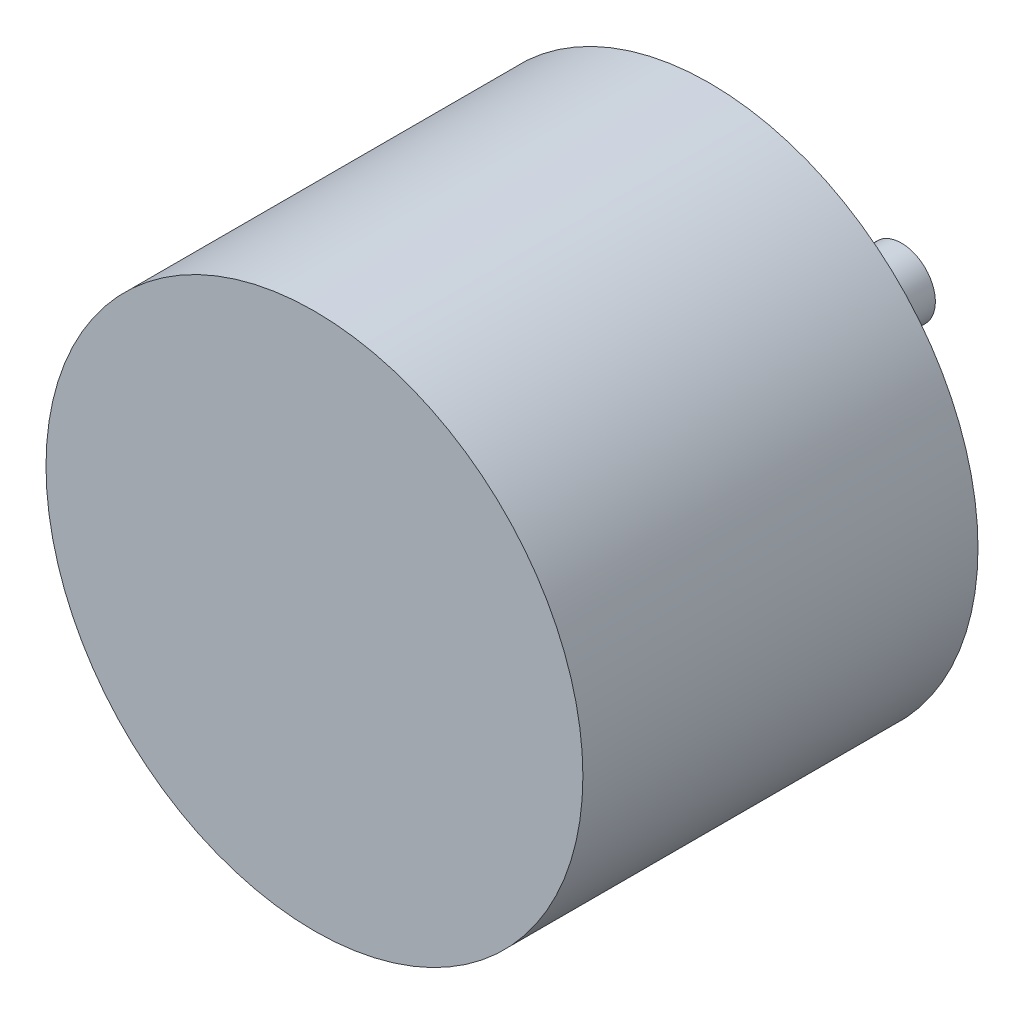
ISO-10303-21;
HEADER;
FILE_DESCRIPTION(('STEP AP214'),'2;1');
FILE_NAME('part.step','',(''),(''),'','','');
FILE_SCHEMA(('AUTOMOTIVE_DESIGN { 1 0 10303 214 1 1 1 1 }'));
ENDSEC;
DATA;
#1=APPLICATION_CONTEXT('core data for automotive mechanical design processes');
#2=APPLICATION_PROTOCOL_DEFINITION('international standard','automotive_design',2000,#1);
#3=PRODUCT_CONTEXT('',#1,'mechanical');
#4=PRODUCT('Part','Part','',(#3));
#5=PRODUCT_RELATED_PRODUCT_CATEGORY('part','',(#4));
#6=PRODUCT_DEFINITION_FORMATION('','',#4);
#7=PRODUCT_DEFINITION_CONTEXT('part definition',#1,'design');
#8=PRODUCT_DEFINITION('design','',#6,#7);
#9=PRODUCT_DEFINITION_SHAPE('','',#8);
#10=(LENGTH_UNIT() NAMED_UNIT(*) SI_UNIT(.MILLI.,.METRE.));
#11=(NAMED_UNIT(*) PLANE_ANGLE_UNIT() SI_UNIT($,.RADIAN.));
#12=(NAMED_UNIT(*) SI_UNIT($,.STERADIAN.) SOLID_ANGLE_UNIT());
#13=UNCERTAINTY_MEASURE_WITH_UNIT(LENGTH_MEASURE(1.E-05),#10,'distance_accuracy_value','');
#14=(GEOMETRIC_REPRESENTATION_CONTEXT(3) GLOBAL_UNCERTAINTY_ASSIGNED_CONTEXT((#13)) GLOBAL_UNIT_ASSIGNED_CONTEXT((#10,
#11,#12)) REPRESENTATION_CONTEXT('',''));
#15=CARTESIAN_POINT('',(0.,0.,0.));
#16=DIRECTION('',(0.,0.,1.));
#17=DIRECTION('',(1.,0.,0.));
#18=AXIS2_PLACEMENT_3D('',#15,#16,#17);
#19=CARTESIAN_POINT('',(-36.9030064596795,0.,9.63283695388817));
#20=DIRECTION('',(0.,0.,-1.));
#21=DIRECTION('',(-1.,0.,0.));
#22=AXIS2_PLACEMENT_3D('',#19,#20,#21);
#23=PLANE('',#22);
#24=CARTESIAN_POINT('',(-36.9030064596795,0.,9.63283695388817));
#25=DIRECTION('',(0.,0.,-1.));
#26=DIRECTION('',(-1.,0.,0.));
#27=AXIS2_PLACEMENT_3D('',#24,#25,#26);
#28=CIRCLE('',#27,23.78);
#29=CARTESIAN_POINT('',(-60.6830064596796,0.,9.63283695388817));
#30=VERTEX_POINT('',#29);
#31=EDGE_CURVE('E10',#30,#30,#28,.T.);
#32=ORIENTED_EDGE('',*,*,#31,.F.);
#33=EDGE_LOOP('',(#32));
#34=FACE_BOUND('',#33,.T.);
#35=ADVANCED_FACE('F32',(#34),#23,.F.);
#36=CARTESIAN_POINT('',(-36.9030064596796,0.,-63.1163378754488));
#37=DIRECTION('',(0.,0.,-1.));
#38=DIRECTION('',(-1.,0.,0.));
#39=AXIS2_PLACEMENT_3D('',#36,#37,#38);
#40=CYLINDRICAL_SURFACE('',#39,23.78);
#41=CARTESIAN_POINT('',(-36.9030064596795,0.,-25.3671630461118));
#42=DIRECTION('',(0.,0.,-1.));
#43=DIRECTION('',(-1.,0.,0.));
#44=AXIS2_PLACEMENT_3D('',#41,#42,#43);
#45=CIRCLE('',#44,23.78);
#46=CARTESIAN_POINT('',(-60.6830064596796,0.,-25.3671630461118));
#47=VERTEX_POINT('',#46);
#48=EDGE_CURVE('E38',#47,#47,#45,.T.);
#49=ORIENTED_EDGE('',*,*,#48,.F.);
#50=EDGE_LOOP('',(#49));
#51=FACE_BOUND('',#50,.T.);
#52=ORIENTED_EDGE('',*,*,#31,.T.);
#53=EDGE_LOOP('',(#52));
#54=FACE_BOUND('',#53,.T.);
#55=ADVANCED_FACE('F95',(#51,#54),#40,.T.);
#56=CARTESIAN_POINT('',(-13.1230064596795,0.,-25.3671630461118));
#57=DIRECTION('',(0.,0.,1.));
#58=DIRECTION('',(1.,0.,0.));
#59=AXIS2_PLACEMENT_3D('',#56,#57,#58);
#60=PLANE('',#59);
#61=CARTESIAN_POINT('',(-25.4030064596795,-11.5,-25.3671630461118));
#62=DIRECTION('',(0.,0.,-1.));
#63=DIRECTION('',(-1.,0.,0.));
#64=AXIS2_PLACEMENT_3D('',#61,#62,#63);
#65=CIRCLE('',#64,2.);
#66=CARTESIAN_POINT('',(-27.4030064596795,-11.5,-25.3671630461118));
#67=VERTEX_POINT('',#66);
#68=EDGE_CURVE('E76',#67,#67,#65,.T.);
#69=ORIENTED_EDGE('',*,*,#68,.F.);
#70=EDGE_LOOP('',(#69));
#71=FACE_BOUND('',#70,.T.);
#72=CARTESIAN_POINT('',(-48.4030064596796,-11.5,-25.3671630461118));
#73=DIRECTION('',(0.,0.,-1.));
#74=DIRECTION('',(-1.,0.,0.));
#75=AXIS2_PLACEMENT_3D('',#72,#73,#74);
#76=CIRCLE('',#75,2.);
#77=CARTESIAN_POINT('',(-50.4030064596796,-11.5,-25.3671630461118));
#78=VERTEX_POINT('',#77);
#79=EDGE_CURVE('E70',#78,#78,#76,.T.);
#80=ORIENTED_EDGE('',*,*,#79,.F.);
#81=EDGE_LOOP('',(#80));
#82=FACE_BOUND('',#81,.T.);
#83=CARTESIAN_POINT('',(-48.4030064596796,11.5,-25.3671630461118));
#84=DIRECTION('',(0.,0.,-1.));
#85=DIRECTION('',(-1.,0.,0.));
#86=AXIS2_PLACEMENT_3D('',#83,#84,#85);
#87=CIRCLE('',#86,2.);
#88=CARTESIAN_POINT('',(-50.4030064596796,11.5,-25.3671630461118));
#89=VERTEX_POINT('',#88);
#90=EDGE_CURVE('E64',#89,#89,#87,.T.);
#91=ORIENTED_EDGE('',*,*,#90,.F.);
#92=EDGE_LOOP('',(#91));
#93=FACE_BOUND('',#92,.T.);
#94=CARTESIAN_POINT('',(-25.4030064596795,11.5,-25.3671630461118));
#95=DIRECTION('',(0.,0.,-1.));
#96=DIRECTION('',(-1.,0.,0.));
#97=AXIS2_PLACEMENT_3D('',#94,#95,#96);
#98=CIRCLE('',#97,2.);
#99=CARTESIAN_POINT('',(-27.4030064596795,11.5,-25.3671630461118));
#100=VERTEX_POINT('',#99);
#101=EDGE_CURVE('E58',#100,#100,#98,.T.);
#102=ORIENTED_EDGE('',*,*,#101,.F.);
#103=EDGE_LOOP('',(#102));
#104=FACE_BOUND('',#103,.T.);
#105=CARTESIAN_POINT('',(-36.9030064596795,0.,-25.3671630461118));
#106=DIRECTION('',(0.,0.,-1.));
#107=DIRECTION('',(-1.,0.,0.));
#108=AXIS2_PLACEMENT_3D('',#105,#106,#107);
#109=CIRCLE('',#108,9.99999999999999);
#110=CARTESIAN_POINT('',(-46.9030064596795,0.,-25.3671630461118));
#111=VERTEX_POINT('',#110);
#112=EDGE_CURVE('E42',#111,#111,#109,.T.);
#113=ORIENTED_EDGE('',*,*,#112,.F.);
#114=EDGE_LOOP('',(#113));
#115=FACE_BOUND('',#114,.T.);
#116=ORIENTED_EDGE('',*,*,#48,.T.);
#117=EDGE_LOOP('',(#116));
#118=FACE_BOUND('',#117,.T.);
#119=ADVANCED_FACE('F91',(#71,#82,#93,#104,#115,#118),#60,.F.);
#120=CARTESIAN_POINT('',(-36.9030064596796,0.,-63.1163378754488));
#121=DIRECTION('',(0.,0.,-1.));
#122=DIRECTION('',(-1.,0.,0.));
#123=AXIS2_PLACEMENT_3D('',#120,#121,#122);
#124=CYLINDRICAL_SURFACE('',#123,9.99999999999999);
#125=CARTESIAN_POINT('',(-36.9030064596795,0.,-29.3671630461118));
#126=DIRECTION('',(0.,0.,-1.));
#127=DIRECTION('',(-1.,0.,0.));
#128=AXIS2_PLACEMENT_3D('',#125,#126,#127);
#129=CIRCLE('',#128,9.99999999999999);
#130=CARTESIAN_POINT('',(-46.9030064596795,0.,-29.3671630461118));
#131=VERTEX_POINT('',#130);
#132=EDGE_CURVE('E46',#131,#131,#129,.T.);
#133=ORIENTED_EDGE('',*,*,#132,.F.);
#134=EDGE_LOOP('',(#133));
#135=FACE_BOUND('',#134,.T.);
#136=ORIENTED_EDGE('',*,*,#112,.T.);
#137=EDGE_LOOP('',(#136));
#138=FACE_BOUND('',#137,.T.);
#139=ADVANCED_FACE('F94',(#135,#138),#124,.T.);
#140=CARTESIAN_POINT('',(-26.9030064596796,0.,-29.3671630461118));
#141=DIRECTION('',(0.,0.,1.));
#142=DIRECTION('',(1.,0.,0.));
#143=AXIS2_PLACEMENT_3D('',#140,#141,#142);
#144=PLANE('',#143);
#145=CARTESIAN_POINT('',(-36.9030064596795,0.,-29.3671630461118));
#146=DIRECTION('',(0.,0.,-1.));
#147=DIRECTION('',(-1.,0.,0.));
#148=AXIS2_PLACEMENT_3D('',#145,#146,#147);
#149=CIRCLE('',#148,2.99999999999999);
#150=CARTESIAN_POINT('',(-39.9030064596795,0.,-29.3671630461118));
#151=VERTEX_POINT('',#150);
#152=EDGE_CURVE('E51',#151,#151,#149,.T.);
#153=ORIENTED_EDGE('',*,*,#152,.F.);
#154=EDGE_LOOP('',(#153));
#155=FACE_BOUND('',#154,.T.);
#156=ORIENTED_EDGE('',*,*,#132,.T.);
#157=EDGE_LOOP('',(#156));
#158=FACE_BOUND('',#157,.T.);
#159=ADVANCED_FACE('F106',(#155,#158),#144,.F.);
#160=CARTESIAN_POINT('',(-36.9030064596796,0.,-63.1163378754488));
#161=DIRECTION('',(0.,0.,-1.));
#162=DIRECTION('',(-1.,0.,0.));
#163=AXIS2_PLACEMENT_3D('',#160,#161,#162);
#164=CYLINDRICAL_SURFACE('',#163,3.);
#165=CARTESIAN_POINT('',(-36.9030064596796,0.,-42.3671630461118));
#166=DIRECTION('',(0.,0.,-1.));
#167=DIRECTION('',(-1.,0.,0.));
#168=AXIS2_PLACEMENT_3D('',#165,#166,#167);
#169=CIRCLE('',#168,3.);
#170=CARTESIAN_POINT('',(-39.9030064596796,0.,-42.3671630461118));
#171=VERTEX_POINT('',#170);
#172=EDGE_CURVE('E54',#171,#171,#169,.T.);
#173=ORIENTED_EDGE('',*,*,#172,.F.);
#174=EDGE_LOOP('',(#173));
#175=FACE_BOUND('',#174,.T.);
#176=ORIENTED_EDGE('',*,*,#152,.T.);
#177=EDGE_LOOP('',(#176));
#178=FACE_BOUND('',#177,.T.);
#179=ADVANCED_FACE('F112',(#175,#178),#164,.T.);
#180=CARTESIAN_POINT('',(-33.9030064596796,0.,-42.3671630461118));
#181=DIRECTION('',(0.,0.,1.));
#182=DIRECTION('',(1.,0.,0.));
#183=AXIS2_PLACEMENT_3D('',#180,#181,#182);
#184=PLANE('',#183);
#185=ORIENTED_EDGE('',*,*,#172,.T.);
#186=EDGE_LOOP('',(#185));
#187=FACE_BOUND('',#186,.T.);
#188=ADVANCED_FACE('F148',(#187),#184,.F.);
#189=CARTESIAN_POINT('',(-25.4030064596795,11.5,-15.3671630461118));
#190=DIRECTION('',(0.,0.,-1.));
#191=DIRECTION('',(-1.,0.,0.));
#192=AXIS2_PLACEMENT_3D('',#189,#190,#191);
#193=CYLINDRICAL_SURFACE('',#192,2.);
#194=CARTESIAN_POINT('',(-25.4030064596795,11.5,-15.3671630461118));
#195=DIRECTION('',(0.,0.,-1.));
#196=DIRECTION('',(-1.,0.,0.));
#197=AXIS2_PLACEMENT_3D('',#194,#195,#196);
#198=CIRCLE('',#197,2.);
#199=CARTESIAN_POINT('',(-27.4030064596795,11.5,-15.3671630461118));
#200=VERTEX_POINT('',#199);
#201=EDGE_CURVE('E57',#200,#200,#198,.T.);
#202=ORIENTED_EDGE('',*,*,#201,.F.);
#203=EDGE_LOOP('',(#202));
#204=FACE_BOUND('',#203,.T.);
#205=ORIENTED_EDGE('',*,*,#101,.T.);
#206=EDGE_LOOP('',(#205));
#207=FACE_BOUND('',#206,.T.);
#208=ADVANCED_FACE('F155',(#204,#207),#193,.F.);
#209=CARTESIAN_POINT('',(-25.4030064596795,11.5,-15.3671630461118));
#210=DIRECTION('',(0.,0.,-1.));
#211=DIRECTION('',(-1.,0.,0.));
#212=AXIS2_PLACEMENT_3D('',#209,#210,#211);
#213=PLANE('',#212);
#214=ORIENTED_EDGE('',*,*,#201,.T.);
#215=EDGE_LOOP('',(#214));
#216=FACE_BOUND('',#215,.T.);
#217=ADVANCED_FACE('F162',(#216),#213,.T.);
#218=CARTESIAN_POINT('',(-48.4030064596796,11.5,-15.3671630461118));
#219=DIRECTION('',(0.,0.,-1.));
#220=DIRECTION('',(-1.,0.,0.));
#221=AXIS2_PLACEMENT_3D('',#218,#219,#220);
#222=CYLINDRICAL_SURFACE('',#221,2.);
#223=CARTESIAN_POINT('',(-48.4030064596796,11.5,-15.3671630461118));
#224=DIRECTION('',(0.,0.,-1.));
#225=DIRECTION('',(-1.,0.,0.));
#226=AXIS2_PLACEMENT_3D('',#223,#224,#225);
#227=CIRCLE('',#226,2.);
#228=CARTESIAN_POINT('',(-50.4030064596796,11.5,-15.3671630461118));
#229=VERTEX_POINT('',#228);
#230=EDGE_CURVE('E61',#229,#229,#227,.T.);
#231=ORIENTED_EDGE('',*,*,#230,.F.);
#232=EDGE_LOOP('',(#231));
#233=FACE_BOUND('',#232,.T.);
#234=ORIENTED_EDGE('',*,*,#90,.T.);
#235=EDGE_LOOP('',(#234));
#236=FACE_BOUND('',#235,.T.);
#237=ADVANCED_FACE('F170',(#233,#236),#222,.F.);
#238=CARTESIAN_POINT('',(-48.4030064596796,11.5,-15.3671630461118));
#239=DIRECTION('',(0.,0.,-1.));
#240=DIRECTION('',(-1.,0.,0.));
#241=AXIS2_PLACEMENT_3D('',#238,#239,#240);
#242=PLANE('',#241);
#243=ORIENTED_EDGE('',*,*,#230,.T.);
#244=EDGE_LOOP('',(#243));
#245=FACE_BOUND('',#244,.T.);
#246=ADVANCED_FACE('F178',(#245),#242,.T.);
#247=CARTESIAN_POINT('',(-48.4030064596796,-11.5,-15.3671630461118));
#248=DIRECTION('',(0.,0.,-1.));
#249=DIRECTION('',(-1.,0.,0.));
#250=AXIS2_PLACEMENT_3D('',#247,#248,#249);
#251=CYLINDRICAL_SURFACE('',#250,2.);
#252=CARTESIAN_POINT('',(-48.4030064596796,-11.5,-15.3671630461118));
#253=DIRECTION('',(0.,0.,-1.));
#254=DIRECTION('',(-1.,0.,0.));
#255=AXIS2_PLACEMENT_3D('',#252,#253,#254);
#256=CIRCLE('',#255,2.);
#257=CARTESIAN_POINT('',(-50.4030064596796,-11.5,-15.3671630461118));
#258=VERTEX_POINT('',#257);
#259=EDGE_CURVE('E67',#258,#258,#256,.T.);
#260=ORIENTED_EDGE('',*,*,#259,.F.);
#261=EDGE_LOOP('',(#260));
#262=FACE_BOUND('',#261,.T.);
#263=ORIENTED_EDGE('',*,*,#79,.T.);
#264=EDGE_LOOP('',(#263));
#265=FACE_BOUND('',#264,.T.);
#266=ADVANCED_FACE('F186',(#262,#265),#251,.F.);
#267=CARTESIAN_POINT('',(-48.4030064596796,-11.5,-15.3671630461118));
#268=DIRECTION('',(0.,0.,-1.));
#269=DIRECTION('',(-1.,0.,0.));
#270=AXIS2_PLACEMENT_3D('',#267,#268,#269);
#271=PLANE('',#270);
#272=ORIENTED_EDGE('',*,*,#259,.T.);
#273=EDGE_LOOP('',(#272));
#274=FACE_BOUND('',#273,.T.);
#275=ADVANCED_FACE('F87',(#274),#271,.T.);
#276=CARTESIAN_POINT('',(-25.4030064596795,-11.5,-15.3671630461118));
#277=DIRECTION('',(0.,0.,-1.));
#278=DIRECTION('',(-1.,0.,0.));
#279=AXIS2_PLACEMENT_3D('',#276,#277,#278);
#280=CYLINDRICAL_SURFACE('',#279,2.);
#281=CARTESIAN_POINT('',(-25.4030064596795,-11.5,-15.3671630461118));
#282=DIRECTION('',(0.,0.,-1.));
#283=DIRECTION('',(-1.,0.,0.));
#284=AXIS2_PLACEMENT_3D('',#281,#282,#283);
#285=CIRCLE('',#284,2.);
#286=CARTESIAN_POINT('',(-27.4030064596795,-11.5,-15.3671630461118));
#287=VERTEX_POINT('',#286);
#288=EDGE_CURVE('E73',#287,#287,#285,.T.);
#289=ORIENTED_EDGE('',*,*,#288,.F.);
#290=EDGE_LOOP('',(#289));
#291=FACE_BOUND('',#290,.T.);
#292=ORIENTED_EDGE('',*,*,#68,.T.);
#293=EDGE_LOOP('',(#292));
#294=FACE_BOUND('',#293,.T.);
#295=ADVANCED_FACE('F84',(#291,#294),#280,.F.);
#296=CARTESIAN_POINT('',(-25.4030064596795,-11.5,-15.3671630461118));
#297=DIRECTION('',(0.,0.,-1.));
#298=DIRECTION('',(-1.,0.,0.));
#299=AXIS2_PLACEMENT_3D('',#296,#297,#298);
#300=PLANE('',#299);
#301=ORIENTED_EDGE('',*,*,#288,.T.);
#302=EDGE_LOOP('',(#301));
#303=FACE_BOUND('',#302,.T.);
#304=ADVANCED_FACE('F82',(#303),#300,.T.);
#305=CLOSED_SHELL('',(#35,#55,#119,#139,#159,#179,#188,#208,#217,#237,#246,#266,#275,#295,#304));
#306=MANIFOLD_SOLID_BREP('B2',#305);
#307=ADVANCED_BREP_SHAPE_REPRESENTATION('',(#18,#306),#14);
#308=SHAPE_DEFINITION_REPRESENTATION(#9,#307);
ENDSEC;
END-ISO-10303-21;
